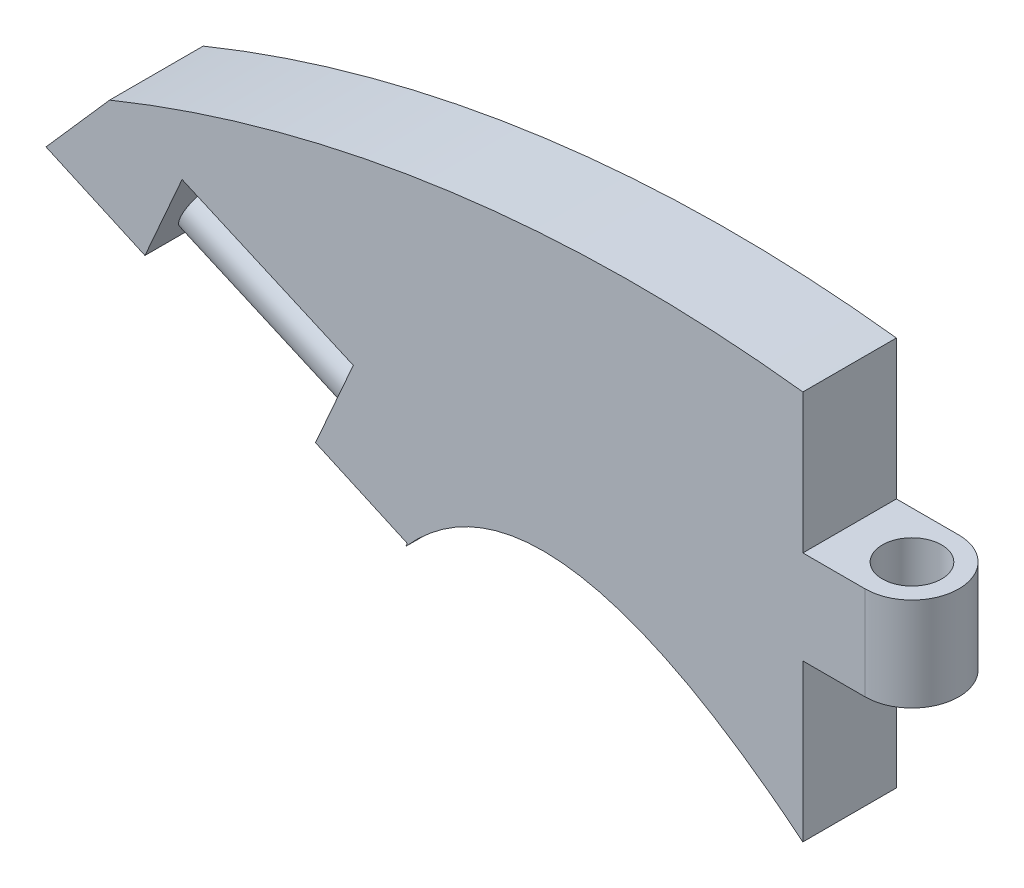
ISO-10303-21;
HEADER;
FILE_DESCRIPTION(('STEP AP214'),'2;1');
FILE_NAME('part.step','',(''),(''),'','','');
FILE_SCHEMA(('AUTOMOTIVE_DESIGN { 1 0 10303 214 1 1 1 1 }'));
ENDSEC;
DATA;
#1=APPLICATION_CONTEXT('core data for automotive mechanical design processes');
#2=APPLICATION_PROTOCOL_DEFINITION('international standard','automotive_design',2000,#1);
#3=PRODUCT_CONTEXT('',#1,'mechanical');
#4=PRODUCT('Part','Part','',(#3));
#5=PRODUCT_RELATED_PRODUCT_CATEGORY('part','',(#4));
#6=PRODUCT_DEFINITION_FORMATION('','',#4);
#7=PRODUCT_DEFINITION_CONTEXT('part definition',#1,'design');
#8=PRODUCT_DEFINITION('design','',#6,#7);
#9=PRODUCT_DEFINITION_SHAPE('','',#8);
#10=(LENGTH_UNIT() NAMED_UNIT(*) SI_UNIT(.MILLI.,.METRE.));
#11=(NAMED_UNIT(*) PLANE_ANGLE_UNIT() SI_UNIT($,.RADIAN.));
#12=(NAMED_UNIT(*) SI_UNIT($,.STERADIAN.) SOLID_ANGLE_UNIT());
#13=UNCERTAINTY_MEASURE_WITH_UNIT(LENGTH_MEASURE(1.E-05),#10,'distance_accuracy_value','');
#14=(GEOMETRIC_REPRESENTATION_CONTEXT(3) GLOBAL_UNCERTAINTY_ASSIGNED_CONTEXT((#13)) GLOBAL_UNIT_ASSIGNED_CONTEXT((#10,
#11,#12)) REPRESENTATION_CONTEXT('',''));
#15=CARTESIAN_POINT('',(0.,0.,0.));
#16=DIRECTION('',(0.,0.,1.));
#17=DIRECTION('',(1.,0.,0.));
#18=AXIS2_PLACEMENT_3D('',#15,#16,#17);
#19=CARTESIAN_POINT('',(0.,24.9429429627554,6.));
#20=DIRECTION('',(-1.,0.,0.));
#21=DIRECTION('',(0.,-1.,0.));
#22=AXIS2_PLACEMENT_3D('',#19,#20,#21);
#23=PLANE('',#22);
#24=DIRECTION('',(0.,0.,1.));
#25=VECTOR('',#24,1.);
#26=CARTESIAN_POINT('',(0.,16.,0.));
#27=LINE('',#26,#25);
#28=CARTESIAN_POINT('',(0.,16.,0.));
#29=VERTEX_POINT('',#28);
#30=CARTESIAN_POINT('',(0.,16.,6.));
#31=VERTEX_POINT('',#30);
#32=EDGE_CURVE('E311',#29,#31,#27,.T.);
#33=ORIENTED_EDGE('',*,*,#32,.F.);
#34=DIRECTION('',(0.,1.,0.));
#35=VECTOR('',#34,1.);
#36=CARTESIAN_POINT('',(0.,24.9429429627554,0.));
#37=LINE('',#36,#35);
#38=CARTESIAN_POINT('',(0.,24.9429429627554,0.));
#39=VERTEX_POINT('',#38);
#40=EDGE_CURVE('E229',#29,#39,#37,.T.);
#41=ORIENTED_EDGE('',*,*,#40,.T.);
#42=DIRECTION('',(0.,0.,-1.));
#43=VECTOR('',#42,1.);
#44=CARTESIAN_POINT('',(0.,24.9429429627554,6.));
#45=LINE('',#44,#43);
#46=CARTESIAN_POINT('',(0.,24.9429429627554,6.));
#47=VERTEX_POINT('',#46);
#48=EDGE_CURVE('E215',#47,#39,#45,.T.);
#49=ORIENTED_EDGE('',*,*,#48,.F.);
#50=DIRECTION('',(0.,1.,0.));
#51=VECTOR('',#50,1.);
#52=CARTESIAN_POINT('',(0.,24.9429429627554,6.));
#53=LINE('',#52,#51);
#54=EDGE_CURVE('E183',#31,#47,#53,.T.);
#55=ORIENTED_EDGE('',*,*,#54,.F.);
#56=EDGE_LOOP('',(#33,#41,#49,#55));
#57=FACE_BOUND('',#56,.T.);
#58=ADVANCED_FACE('F44',(#57),#23,.F.);
#59=CARTESIAN_POINT('',(-26.5690337061667,2.2643951105344,6.));
#60=CARTESIAN_POINT('',(-17.747364857478,14.3657386719387,6.));
#61=CARTESIAN_POINT('',(0.,-0.0570570372445886,6.));
#62=B_SPLINE_CURVE_WITH_KNOTS('',2,(#59,#60,#61),.UNSPECIFIED.,.F.,.F.,(3,3),(0.,1.),.UNSPECIFIED.);
#63=DIRECTION('',(0.,0.,-1.));
#64=VECTOR('',#63,1.);
#65=SURFACE_OF_LINEAR_EXTRUSION('',#62,#64);
#66=CARTESIAN_POINT('',(-25.4694063612336,3.63105146981876,6.));
#67=VERTEX_POINT('',#66);
#68=CARTESIAN_POINT('',(0.,-0.0570570372445886,6.));
#69=VERTEX_POINT('',#68);
#70=EDGE_CURVE('E220',#67,#69,#62,.T.);
#71=ORIENTED_EDGE('',*,*,#70,.F.);
#72=DIRECTION('',(0.,0.,-1.));
#73=VECTOR('',#72,1.);
#74=CARTESIAN_POINT('',(-25.4694063739104,3.63105144167228,6.));
#75=LINE('',#74,#73);
#76=CARTESIAN_POINT('',(-25.4694063612336,3.63105146981873,0.));
#77=VERTEX_POINT('',#76);
#78=EDGE_CURVE('E156',#67,#77,#75,.T.);
#79=ORIENTED_EDGE('',*,*,#78,.T.);
#80=CARTESIAN_POINT('',(-26.5690337061667,2.2643951105344,0.));
#81=CARTESIAN_POINT('',(-17.747364857478,14.3657386719387,0.));
#82=CARTESIAN_POINT('',(0.,-0.0570570372445886,0.));
#83=B_SPLINE_CURVE_WITH_KNOTS('',2,(#80,#81,#82),.UNSPECIFIED.,.F.,.F.,(3,3),(0.,1.),.UNSPECIFIED.);
#84=CARTESIAN_POINT('',(0.,-0.0570570372445886,0.));
#85=VERTEX_POINT('',#84);
#86=EDGE_CURVE('E230',#77,#85,#83,.T.);
#87=ORIENTED_EDGE('',*,*,#86,.T.);
#88=DIRECTION('',(0.,0.,-1.));
#89=VECTOR('',#88,1.);
#90=CARTESIAN_POINT('',(0.,-0.0570570372445886,6.));
#91=LINE('',#90,#89);
#92=EDGE_CURVE('E186',#69,#85,#91,.T.);
#93=ORIENTED_EDGE('',*,*,#92,.F.);
#94=EDGE_LOOP('',(#71,#79,#87,#93));
#95=FACE_BOUND('',#94,.T.);
#96=ADVANCED_FACE('F252',(#95),#65,.F.);
#97=CARTESIAN_POINT('',(0.,10.,0.));
#98=VERTEX_POINT('',#97);
#99=EDGE_CURVE('E223',#85,#98,#37,.T.);
#100=ORIENTED_EDGE('',*,*,#99,.T.);
#101=DIRECTION('',(0.,0.,1.));
#102=VECTOR('',#101,1.);
#103=CARTESIAN_POINT('',(0.,10.,0.));
#104=LINE('',#103,#102);
#105=CARTESIAN_POINT('',(0.,10.,6.));
#106=VERTEX_POINT('',#105);
#107=EDGE_CURVE('E226',#98,#106,#104,.T.);
#108=ORIENTED_EDGE('',*,*,#107,.T.);
#109=EDGE_CURVE('E222',#69,#106,#53,.T.);
#110=ORIENTED_EDGE('',*,*,#109,.F.);
#111=ORIENTED_EDGE('',*,*,#92,.T.);
#112=EDGE_LOOP('',(#100,#108,#110,#111));
#113=FACE_BOUND('',#112,.T.);
#114=ADVANCED_FACE('F251',(#113),#23,.F.);
#115=CARTESIAN_POINT('',(-10.6005640912535,-64.0343490410568,6.));
#116=DIRECTION('',(0.,0.,-1.));
#117=DIRECTION('',(-1.,0.,0.));
#118=AXIS2_PLACEMENT_3D('',#115,#116,#117);
#119=CYLINDRICAL_SURFACE('',#118,89.6065312986974);
#120=CARTESIAN_POINT('',(-10.6005640912535,-64.0343490410568,0.));
#121=DIRECTION('',(0.,0.,1.));
#122=DIRECTION('',(1.,0.,0.));
#123=AXIS2_PLACEMENT_3D('',#120,#121,#122);
#124=CIRCLE('',#123,89.6065312986974);
#125=CARTESIAN_POINT('',(-44.4696566683427,18.9247675127555,0.));
#126=VERTEX_POINT('',#125);
#127=EDGE_CURVE('E184',#39,#126,#124,.T.);
#128=ORIENTED_EDGE('',*,*,#127,.T.);
#129=DIRECTION('',(0.,0.,1.));
#130=VECTOR('',#129,1.);
#131=CARTESIAN_POINT('',(-44.4696566683427,18.9247675127555,-4.));
#132=LINE('',#131,#130);
#133=CARTESIAN_POINT('',(-44.4696566683427,18.9247675127555,6.));
#134=VERTEX_POINT('',#133);
#135=EDGE_CURVE('E189',#126,#134,#132,.T.);
#136=ORIENTED_EDGE('',*,*,#135,.T.);
#137=CARTESIAN_POINT('',(-10.6005640912535,-64.0343490410568,6.));
#138=DIRECTION('',(0.,0.,1.));
#139=DIRECTION('',(1.,0.,0.));
#140=AXIS2_PLACEMENT_3D('',#137,#138,#139);
#141=CIRCLE('',#140,89.6065312986974);
#142=EDGE_CURVE('E177',#47,#134,#141,.T.);
#143=ORIENTED_EDGE('',*,*,#142,.F.);
#144=ORIENTED_EDGE('',*,*,#48,.T.);
#145=EDGE_LOOP('',(#128,#136,#143,#144));
#146=FACE_BOUND('',#145,.T.);
#147=ADVANCED_FACE('F259',(#146),#119,.T.);
#148=CARTESIAN_POINT('',(-15.5159408552806,7.73470385429179,6.));
#149=DIRECTION('',(0.,0.,1.));
#150=DIRECTION('',(1.,0.,0.));
#151=AXIS2_PLACEMENT_3D('',#148,#149,#150);
#152=PLANE('',#151);
#153=DIRECTION('',(0.660399340319583,0.750914583228652,0.));
#154=VECTOR('',#153,1.);
#155=CARTESIAN_POINT('',(-44.4696566683427,18.9247675127555,6.));
#156=LINE('',#155,#154);
#157=CARTESIAN_POINT('',(-48.5537513407177,14.2809012010648,6.));
#158=VERTEX_POINT('',#157);
#159=EDGE_CURVE('E11',#158,#134,#156,.T.);
#160=ORIENTED_EDGE('',*,*,#159,.F.);
#161=DIRECTION('',(-0.911789762444248,0.410657313464476,0.));
#162=VECTOR('',#161,1.);
#163=CARTESIAN_POINT('',(-25.3746805051788,3.84137297867232,6.));
#164=LINE('',#163,#162);
#165=CARTESIAN_POINT('',(-42.2053473103012,11.4216691156669,6.));
#166=VERTEX_POINT('',#165);
#167=EDGE_CURVE('E161',#166,#158,#164,.T.);
#168=ORIENTED_EDGE('',*,*,#167,.F.);
#169=DIRECTION('',(-0.402676831385737,-0.915342214401337,0.));
#170=VECTOR('',#169,1.);
#171=CARTESIAN_POINT('',(-43.0451935653907,9.51257807547768,6.));
#172=LINE('',#171,#170);
#173=CARTESIAN_POINT('',(-39.8237789143048,16.8353157906884,6.));
#174=VERTEX_POINT('',#173);
#175=EDGE_CURVE('E349',#174,#166,#172,.T.);
#176=ORIENTED_EDGE('',*,*,#175,.F.);
#177=DIRECTION('',(-0.915342214401336,0.402676831385738,0.));
#178=VECTOR('',#177,1.);
#179=CARTESIAN_POINT('',(-39.8237789143048,16.8353157906884,6.));
#180=LINE('',#179,#178);
#181=CARTESIAN_POINT('',(-28.8396723414888,12.0031938140595,6.));
#182=VERTEX_POINT('',#181);
#183=EDGE_CURVE('E360',#182,#174,#180,.T.);
#184=ORIENTED_EDGE('',*,*,#183,.F.);
#185=DIRECTION('',(0.402676831385737,0.915342214401337,0.));
#186=VECTOR('',#185,1.);
#187=CARTESIAN_POINT('',(-28.8396723414888,12.0031938140595,6.));
#188=LINE('',#187,#186);
#189=CARTESIAN_POINT('',(-31.2634526838728,6.49359332826711,6.));
#190=VERTEX_POINT('',#189);
#191=EDGE_CURVE('E166',#190,#182,#188,.T.);
#192=ORIENTED_EDGE('',*,*,#191,.F.);
#193=CARTESIAN_POINT('',(-25.3746805051788,3.84137297867232,6.));
#194=VERTEX_POINT('',#193);
#195=EDGE_CURVE('E47',#194,#190,#164,.T.);
#196=ORIENTED_EDGE('',*,*,#195,.F.);
#197=DIRECTION('',(0.410657313464476,0.911789762444248,0.));
#198=VECTOR('',#197,1.);
#199=CARTESIAN_POINT('',(-26.3450096628576,1.68693383156751,6.));
#200=LINE('',#199,#198);
#201=EDGE_CURVE('E157',#67,#194,#200,.T.);
#202=ORIENTED_EDGE('',*,*,#201,.F.);
#203=ORIENTED_EDGE('',*,*,#70,.T.);
#204=ORIENTED_EDGE('',*,*,#109,.T.);
#205=DIRECTION('',(1.,0.,0.));
#206=VECTOR('',#205,1.);
#207=CARTESIAN_POINT('',(0.,10.,6.));
#208=LINE('',#207,#206);
#209=CARTESIAN_POINT('',(4.,10.,6.));
#210=VERTEX_POINT('',#209);
#211=EDGE_CURVE('E239',#106,#210,#208,.T.);
#212=ORIENTED_EDGE('',*,*,#211,.T.);
#213=DIRECTION('',(0.,-1.,0.));
#214=VECTOR('',#213,1.);
#215=CARTESIAN_POINT('',(4.,16.,6.));
#216=LINE('',#215,#214);
#217=CARTESIAN_POINT('',(4.,16.,6.));
#218=VERTEX_POINT('',#217);
#219=EDGE_CURVE('E319',#218,#210,#216,.T.);
#220=ORIENTED_EDGE('',*,*,#219,.F.);
#221=DIRECTION('',(1.,0.,0.));
#222=VECTOR('',#221,1.);
#223=CARTESIAN_POINT('',(0.,16.,6.));
#224=LINE('',#223,#222);
#225=EDGE_CURVE('E320',#31,#218,#224,.T.);
#226=ORIENTED_EDGE('',*,*,#225,.F.);
#227=ORIENTED_EDGE('',*,*,#54,.T.);
#228=ORIENTED_EDGE('',*,*,#142,.T.);
#229=EDGE_LOOP('',(#160,#168,#176,#184,#192,#196,#202,#203,#204,#212,#220,#226,#227,#228));
#230=FACE_BOUND('',#229,.T.);
#231=ADVANCED_FACE('F50',(#230),#152,.T.);
#232=CARTESIAN_POINT('',(-15.5159408552806,7.73470385429179,0.));
#233=DIRECTION('',(0.,0.,1.));
#234=DIRECTION('',(1.,0.,0.));
#235=AXIS2_PLACEMENT_3D('',#232,#233,#234);
#236=PLANE('',#235);
#237=DIRECTION('',(-0.911789762444249,0.410657313464476,0.));
#238=VECTOR('',#237,1.);
#239=CARTESIAN_POINT('',(-18.6363051640887,0.806503287583271,0.));
#240=LINE('',#239,#238);
#241=CARTESIAN_POINT('',(-42.2053473103012,11.4216691156669,0.));
#242=VERTEX_POINT('',#241);
#243=CARTESIAN_POINT('',(-48.5537513407177,14.2809012010648,0.));
#244=VERTEX_POINT('',#243);
#245=EDGE_CURVE('E182',#242,#244,#240,.T.);
#246=ORIENTED_EDGE('',*,*,#245,.T.);
#247=DIRECTION('',(0.660399340319583,0.750914583228652,0.));
#248=VECTOR('',#247,1.);
#249=CARTESIAN_POINT('',(-37.3913427751466,26.9732448545087,0.));
#250=LINE('',#249,#248);
#251=EDGE_CURVE('E63',#244,#126,#250,.T.);
#252=ORIENTED_EDGE('',*,*,#251,.T.);
#253=ORIENTED_EDGE('',*,*,#127,.F.);
#254=ORIENTED_EDGE('',*,*,#40,.F.);
#255=DIRECTION('',(-1.,0.,0.));
#256=VECTOR('',#255,1.);
#257=CARTESIAN_POINT('',(0.,16.,0.));
#258=LINE('',#257,#256);
#259=CARTESIAN_POINT('',(4.,16.,0.));
#260=VERTEX_POINT('',#259);
#261=EDGE_CURVE('E322',#260,#29,#258,.T.);
#262=ORIENTED_EDGE('',*,*,#261,.F.);
#263=DIRECTION('',(0.,-1.,0.));
#264=VECTOR('',#263,1.);
#265=CARTESIAN_POINT('',(4.,16.,0.));
#266=LINE('',#265,#264);
#267=CARTESIAN_POINT('',(4.,10.,0.));
#268=VERTEX_POINT('',#267);
#269=EDGE_CURVE('E201',#260,#268,#266,.T.);
#270=ORIENTED_EDGE('',*,*,#269,.T.);
#271=DIRECTION('',(-1.,0.,0.));
#272=VECTOR('',#271,1.);
#273=CARTESIAN_POINT('',(0.,10.,0.));
#274=LINE('',#273,#272);
#275=EDGE_CURVE('E196',#268,#98,#274,.T.);
#276=ORIENTED_EDGE('',*,*,#275,.T.);
#277=ORIENTED_EDGE('',*,*,#99,.F.);
#278=ORIENTED_EDGE('',*,*,#86,.F.);
#279=DIRECTION('',(0.410657313464476,0.911789762444248,0.));
#280=VECTOR('',#279,1.);
#281=CARTESIAN_POINT('',(-22.2543161963707,10.7695735453808,0.));
#282=LINE('',#281,#280);
#283=CARTESIAN_POINT('',(-25.3746805051788,3.84137297867232,0.));
#284=VERTEX_POINT('',#283);
#285=EDGE_CURVE('E195',#77,#284,#282,.T.);
#286=ORIENTED_EDGE('',*,*,#285,.T.);
#287=CARTESIAN_POINT('',(-31.2634526838728,6.4935933282671,0.));
#288=VERTEX_POINT('',#287);
#289=EDGE_CURVE('E146',#284,#288,#240,.T.);
#290=ORIENTED_EDGE('',*,*,#289,.T.);
#291=DIRECTION('',(0.402676831385737,0.915342214401337,0.));
#292=VECTOR('',#291,1.);
#293=CARTESIAN_POINT('',(-28.2525578738297,13.3377892390922,0.));
#294=LINE('',#293,#292);
#295=CARTESIAN_POINT('',(-28.8396723414888,12.0031938140595,0.));
#296=VERTEX_POINT('',#295);
#297=EDGE_CURVE('E192',#288,#296,#294,.T.);
#298=ORIENTED_EDGE('',*,*,#297,.T.);
#299=DIRECTION('',(-0.915342214401337,0.402676831385738,0.));
#300=VECTOR('',#299,1.);
#301=CARTESIAN_POINT('',(-16.1030553229397,6.40010842925907,0.));
#302=LINE('',#301,#300);
#303=CARTESIAN_POINT('',(-39.8237789143048,16.8353157906884,0.));
#304=VERTEX_POINT('',#303);
#305=EDGE_CURVE('E200',#296,#304,#302,.T.);
#306=ORIENTED_EDGE('',*,*,#305,.T.);
#307=DIRECTION('',(-0.402676831385737,-0.915342214401337,0.));
#308=VECTOR('',#307,1.);
#309=CARTESIAN_POINT('',(-39.2366644466458,18.1699112157211,0.));
#310=LINE('',#309,#308);
#311=EDGE_CURVE('E355',#304,#242,#310,.T.);
#312=ORIENTED_EDGE('',*,*,#311,.T.);
#313=EDGE_LOOP('',(#246,#252,#253,#254,#262,#270,#276,#277,#278,#286,#290,#298,#306,#312));
#314=FACE_BOUND('',#313,.T.);
#315=ADVANCED_FACE('F275',(#314),#236,.F.);
#316=CARTESIAN_POINT('',(-43.0451935653907,9.51257807547768,-4.));
#317=DIRECTION('',(-0.915342214401337,0.402676831385737,0.));
#318=DIRECTION('',(-0.402676831385737,-0.915342214401337,0.));
#319=AXIS2_PLACEMENT_3D('',#316,#317,#318);
#320=PLANE('',#319);
#321=CARTESIAN_POINT('',(-41.4344862398478,13.173946933083,3.));
#322=DIRECTION('',(-0.915342214401337,0.402676831385737,0.));
#323=DIRECTION('',(-0.402676831385737,-0.915342214401337,0.));
#324=AXIS2_PLACEMENT_3D('',#321,#322,#323);
#325=CIRCLE('',#324,1.5);
#326=CARTESIAN_POINT('',(-42.0385014869264,11.800933611481,3.));
#327=VERTEX_POINT('',#326);
#328=EDGE_CURVE('E374',#327,#327,#325,.F.);
#329=ORIENTED_EDGE('',*,*,#328,.F.);
#330=EDGE_LOOP('',(#329));
#331=FACE_BOUND('',#330,.T.);
#332=ORIENTED_EDGE('',*,*,#175,.T.);
#333=DIRECTION('',(0.,0.,-1.));
#334=VECTOR('',#333,1.);
#335=CARTESIAN_POINT('',(-42.2053473103012,11.4216691156669,-4.));
#336=LINE('',#335,#334);
#337=EDGE_CURVE('E341',#166,#242,#336,.T.);
#338=ORIENTED_EDGE('',*,*,#337,.T.);
#339=ORIENTED_EDGE('',*,*,#311,.F.);
#340=DIRECTION('',(0.,0.,1.));
#341=VECTOR('',#340,1.);
#342=CARTESIAN_POINT('',(-39.8237789143048,16.8353157906884,-4.));
#343=LINE('',#342,#341);
#344=EDGE_CURVE('E350',#304,#174,#343,.T.);
#345=ORIENTED_EDGE('',*,*,#344,.T.);
#346=EDGE_LOOP('',(#332,#338,#339,#345));
#347=FACE_BOUND('',#346,.T.);
#348=ADVANCED_FACE('F270',(#331,#347),#320,.F.);
#349=CARTESIAN_POINT('',(-39.8237789143048,16.8353157906884,-4.));
#350=DIRECTION('',(0.402676831385738,0.915342214401337,0.));
#351=DIRECTION('',(-0.915342214401337,0.402676831385738,0.));
#352=AXIS2_PLACEMENT_3D('',#349,#350,#351);
#353=PLANE('',#352);
#354=DIRECTION('',(0.,0.,1.));
#355=VECTOR('',#354,1.);
#356=CARTESIAN_POINT('',(-28.8396723414888,12.0031938140595,-4.));
#357=LINE('',#356,#355);
#358=EDGE_CURVE('E244',#296,#182,#357,.T.);
#359=ORIENTED_EDGE('',*,*,#358,.T.);
#360=ORIENTED_EDGE('',*,*,#183,.T.);
#361=ORIENTED_EDGE('',*,*,#344,.F.);
#362=ORIENTED_EDGE('',*,*,#305,.F.);
#363=EDGE_LOOP('',(#359,#360,#361,#362));
#364=FACE_BOUND('',#363,.T.);
#365=ADVANCED_FACE('F261',(#364),#353,.F.);
#366=CARTESIAN_POINT('',(-28.8396723414888,12.0031938140595,-4.));
#367=DIRECTION('',(0.915342214401337,-0.402676831385737,0.));
#368=DIRECTION('',(0.402676831385737,0.915342214401337,0.));
#369=AXIS2_PLACEMENT_3D('',#366,#367,#368);
#370=PLANE('',#369);
#371=CARTESIAN_POINT('',(-30.4503796670317,8.34182495645417,3.));
#372=DIRECTION('',(0.915342214401337,-0.402676831385737,0.));
#373=DIRECTION('',(0.402676831385737,0.915342214401337,0.));
#374=AXIS2_PLACEMENT_3D('',#371,#372,#373);
#375=CIRCLE('',#374,1.5);
#376=CARTESIAN_POINT('',(-29.8463644199531,9.71483827805618,3.));
#377=VERTEX_POINT('',#376);
#378=EDGE_CURVE('E366',#377,#377,#375,.F.);
#379=ORIENTED_EDGE('',*,*,#378,.F.);
#380=EDGE_LOOP('',(#379));
#381=FACE_BOUND('',#380,.T.);
#382=ORIENTED_EDGE('',*,*,#297,.F.);
#383=DIRECTION('',(0.,0.,1.));
#384=VECTOR('',#383,1.);
#385=CARTESIAN_POINT('',(-31.2634526838728,6.4935933282671,-4.));
#386=LINE('',#385,#384);
#387=EDGE_CURVE('E361',#288,#190,#386,.T.);
#388=ORIENTED_EDGE('',*,*,#387,.T.);
#389=ORIENTED_EDGE('',*,*,#191,.T.);
#390=ORIENTED_EDGE('',*,*,#358,.F.);
#391=EDGE_LOOP('',(#382,#388,#389,#390));
#392=FACE_BOUND('',#391,.T.);
#393=ADVANCED_FACE('F258',(#381,#392),#370,.F.);
#394=CARTESIAN_POINT('',(-52.4204234970926,18.0068742633746,3.));
#395=DIRECTION('',(0.915342214401337,-0.402676831385737,0.));
#396=DIRECTION('',(0.402676831385737,0.915342214401337,0.));
#397=AXIS2_PLACEMENT_3D('',#394,#395,#396);
#398=CYLINDRICAL_SURFACE('',#397,1.5);
#399=ORIENTED_EDGE('',*,*,#378,.T.);
#400=EDGE_LOOP('',(#399));
#401=FACE_BOUND('',#400,.T.);
#402=ORIENTED_EDGE('',*,*,#328,.T.);
#403=EDGE_LOOP('',(#402));
#404=FACE_BOUND('',#403,.T.);
#405=ADVANCED_FACE('F264',(#401,#404),#398,.T.);
#406=CARTESIAN_POINT('',(4.,16.,3.));
#407=DIRECTION('',(0.,-1.,0.));
#408=DIRECTION('',(0.,0.,-1.));
#409=AXIS2_PLACEMENT_3D('',#406,#407,#408);
#410=CYLINDRICAL_SURFACE('',#409,3.);
#411=CARTESIAN_POINT('',(4.,10.,3.));
#412=DIRECTION('',(0.,1.,0.));
#413=DIRECTION('',(0.,0.,-1.));
#414=AXIS2_PLACEMENT_3D('',#411,#412,#413);
#415=CIRCLE('',#414,3.);
#416=EDGE_CURVE('E367',#210,#268,#415,.T.);
#417=ORIENTED_EDGE('',*,*,#416,.T.);
#418=ORIENTED_EDGE('',*,*,#269,.F.);
#419=CARTESIAN_POINT('',(4.,16.,3.));
#420=DIRECTION('',(0.,1.,0.));
#421=DIRECTION('',(0.,0.,-1.));
#422=AXIS2_PLACEMENT_3D('',#419,#420,#421);
#423=CIRCLE('',#422,3.);
#424=EDGE_CURVE('E321',#218,#260,#423,.T.);
#425=ORIENTED_EDGE('',*,*,#424,.F.);
#426=ORIENTED_EDGE('',*,*,#219,.T.);
#427=EDGE_LOOP('',(#417,#418,#425,#426));
#428=FACE_BOUND('',#427,.T.);
#429=ADVANCED_FACE('F277',(#428),#410,.T.);
#430=CARTESIAN_POINT('',(4.,16.,3.));
#431=DIRECTION('',(0.,-1.,0.));
#432=DIRECTION('',(0.,0.,-1.));
#433=AXIS2_PLACEMENT_3D('',#430,#431,#432);
#434=PLANE('',#433);
#435=CARTESIAN_POINT('',(4.,16.,3.));
#436=DIRECTION('',(0.,1.,0.));
#437=DIRECTION('',(0.,0.,1.));
#438=AXIS2_PLACEMENT_3D('',#435,#436,#437);
#439=CIRCLE('',#438,1.9);
#440=CARTESIAN_POINT('',(4.,16.,4.9));
#441=VERTEX_POINT('',#440);
#442=EDGE_CURVE('E154',#441,#441,#439,.T.);
#443=ORIENTED_EDGE('',*,*,#442,.F.);
#444=EDGE_LOOP('',(#443));
#445=FACE_BOUND('',#444,.T.);
#446=ORIENTED_EDGE('',*,*,#32,.T.);
#447=ORIENTED_EDGE('',*,*,#225,.T.);
#448=ORIENTED_EDGE('',*,*,#424,.T.);
#449=ORIENTED_EDGE('',*,*,#261,.T.);
#450=EDGE_LOOP('',(#446,#447,#448,#449));
#451=FACE_BOUND('',#450,.T.);
#452=ADVANCED_FACE('F278',(#445,#451),#434,.F.);
#453=CARTESIAN_POINT('',(4.,10.,3.));
#454=DIRECTION('',(0.,-1.,0.));
#455=DIRECTION('',(0.,0.,-1.));
#456=AXIS2_PLACEMENT_3D('',#453,#454,#455);
#457=PLANE('',#456);
#458=CARTESIAN_POINT('',(4.,10.,3.));
#459=DIRECTION('',(0.,1.,0.));
#460=DIRECTION('',(0.,0.,1.));
#461=AXIS2_PLACEMENT_3D('',#458,#459,#460);
#462=CIRCLE('',#461,1.9);
#463=CARTESIAN_POINT('',(4.,10.,4.9));
#464=VERTEX_POINT('',#463);
#465=EDGE_CURVE('E330',#464,#464,#462,.T.);
#466=ORIENTED_EDGE('',*,*,#465,.T.);
#467=EDGE_LOOP('',(#466));
#468=FACE_BOUND('',#467,.T.);
#469=ORIENTED_EDGE('',*,*,#107,.F.);
#470=ORIENTED_EDGE('',*,*,#275,.F.);
#471=ORIENTED_EDGE('',*,*,#416,.F.);
#472=ORIENTED_EDGE('',*,*,#211,.F.);
#473=EDGE_LOOP('',(#469,#470,#471,#472));
#474=FACE_BOUND('',#473,.T.);
#475=ADVANCED_FACE('F285',(#468,#474),#457,.T.);
#476=CARTESIAN_POINT('',(4.,10.,3.));
#477=DIRECTION('',(0.,1.,0.));
#478=DIRECTION('',(0.,0.,1.));
#479=AXIS2_PLACEMENT_3D('',#476,#477,#478);
#480=CYLINDRICAL_SURFACE('',#479,1.9);
#481=ORIENTED_EDGE('',*,*,#465,.F.);
#482=EDGE_LOOP('',(#481));
#483=FACE_BOUND('',#482,.T.);
#484=ORIENTED_EDGE('',*,*,#442,.T.);
#485=EDGE_LOOP('',(#484));
#486=FACE_BOUND('',#485,.T.);
#487=ADVANCED_FACE('F283',(#483,#486),#480,.F.);
#488=CARTESIAN_POINT('',(-25.3746805051788,3.84137297867232,-4.));
#489=DIRECTION('',(0.410657313464476,0.911789762444248,0.));
#490=DIRECTION('',(-0.911789762444249,0.410657313464476,0.));
#491=AXIS2_PLACEMENT_3D('',#488,#489,#490);
#492=PLANE('',#491);
#493=DIRECTION('',(0.,0.,1.));
#494=VECTOR('',#493,1.);
#495=CARTESIAN_POINT('',(-25.3746805051788,3.84137297867232,-4.));
#496=LINE('',#495,#494);
#497=EDGE_CURVE('E141',#284,#194,#496,.T.);
#498=ORIENTED_EDGE('',*,*,#497,.T.);
#499=ORIENTED_EDGE('',*,*,#195,.T.);
#500=ORIENTED_EDGE('',*,*,#387,.F.);
#501=ORIENTED_EDGE('',*,*,#289,.F.);
#502=EDGE_LOOP('',(#498,#499,#500,#501));
#503=FACE_BOUND('',#502,.T.);
#504=ADVANCED_FACE('F143',(#503),#492,.F.);
#505=CARTESIAN_POINT('',(-26.3450096628576,1.68693383156751,-4.));
#506=DIRECTION('',(0.911789762444249,-0.410657313464476,0.));
#507=DIRECTION('',(0.410657313464476,0.911789762444248,0.));
#508=AXIS2_PLACEMENT_3D('',#505,#506,#507);
#509=PLANE('',#508);
#510=ORIENTED_EDGE('',*,*,#201,.T.);
#511=ORIENTED_EDGE('',*,*,#497,.F.);
#512=ORIENTED_EDGE('',*,*,#285,.F.);
#513=ORIENTED_EDGE('',*,*,#78,.F.);
#514=EDGE_LOOP('',(#510,#511,#512,#513));
#515=FACE_BOUND('',#514,.T.);
#516=ADVANCED_FACE('F159',(#515),#509,.F.);
#517=ORIENTED_EDGE('',*,*,#167,.T.);
#518=DIRECTION('',(0.,0.,-1.));
#519=VECTOR('',#518,1.);
#520=CARTESIAN_POINT('',(-48.5537513407177,14.2809012010648,-4.));
#521=LINE('',#520,#519);
#522=EDGE_CURVE('E57',#158,#244,#521,.T.);
#523=ORIENTED_EDGE('',*,*,#522,.T.);
#524=ORIENTED_EDGE('',*,*,#245,.F.);
#525=ORIENTED_EDGE('',*,*,#337,.F.);
#526=EDGE_LOOP('',(#517,#523,#524,#525));
#527=FACE_BOUND('',#526,.T.);
#528=ADVANCED_FACE('F294',(#527),#492,.F.);
#529=CARTESIAN_POINT('',(-44.4696566683427,18.9247675127555,-4.));
#530=DIRECTION('',(0.750914583228652,-0.660399340319583,0.));
#531=DIRECTION('',(0.660399340319583,0.750914583228652,0.));
#532=AXIS2_PLACEMENT_3D('',#529,#530,#531);
#533=PLANE('',#532);
#534=ORIENTED_EDGE('',*,*,#522,.F.);
#535=ORIENTED_EDGE('',*,*,#159,.T.);
#536=ORIENTED_EDGE('',*,*,#135,.F.);
#537=ORIENTED_EDGE('',*,*,#251,.F.);
#538=EDGE_LOOP('',(#534,#535,#536,#537));
#539=FACE_BOUND('',#538,.T.);
#540=ADVANCED_FACE('F298',(#539),#533,.F.);
#541=CLOSED_SHELL('',(#58,#96,#114,#147,#231,#315,#348,#365,#393,#405,#429,#452,#475,#487,#504,
#516,#528,#540));
#542=MANIFOLD_SOLID_BREP('B2',#541);
#543=ADVANCED_BREP_SHAPE_REPRESENTATION('',(#18,#542),#14);
#544=SHAPE_DEFINITION_REPRESENTATION(#9,#543);
ENDSEC;
END-ISO-10303-21;
